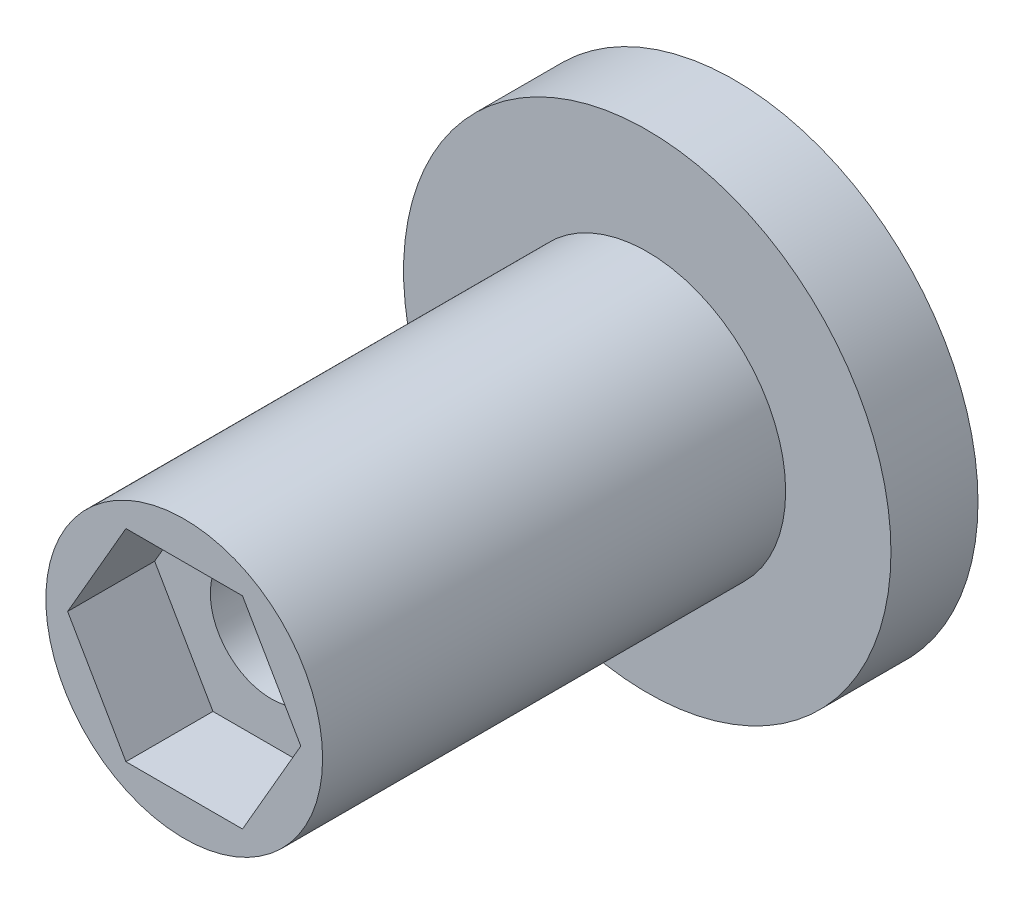
ISO-10303-21;
HEADER;
FILE_DESCRIPTION(('STEP AP214'),'2;1');
FILE_NAME('part.step','',(''),(''),'','','');
FILE_SCHEMA(('AUTOMOTIVE_DESIGN { 1 0 10303 214 1 1 1 1 }'));
ENDSEC;
DATA;
#1=APPLICATION_CONTEXT('core data for automotive mechanical design processes');
#2=APPLICATION_PROTOCOL_DEFINITION('international standard','automotive_design',2000,#1);
#3=PRODUCT_CONTEXT('',#1,'mechanical');
#4=PRODUCT('Part','Part','',(#3));
#5=PRODUCT_RELATED_PRODUCT_CATEGORY('part','',(#4));
#6=PRODUCT_DEFINITION_FORMATION('','',#4);
#7=PRODUCT_DEFINITION_CONTEXT('part definition',#1,'design');
#8=PRODUCT_DEFINITION('design','',#6,#7);
#9=PRODUCT_DEFINITION_SHAPE('','',#8);
#10=(LENGTH_UNIT() NAMED_UNIT(*) SI_UNIT(.MILLI.,.METRE.));
#11=(NAMED_UNIT(*) PLANE_ANGLE_UNIT() SI_UNIT($,.RADIAN.));
#12=(NAMED_UNIT(*) SI_UNIT($,.STERADIAN.) SOLID_ANGLE_UNIT());
#13=UNCERTAINTY_MEASURE_WITH_UNIT(LENGTH_MEASURE(1.E-05),#10,'distance_accuracy_value','');
#14=(GEOMETRIC_REPRESENTATION_CONTEXT(3) GLOBAL_UNCERTAINTY_ASSIGNED_CONTEXT((#13)) GLOBAL_UNIT_ASSIGNED_CONTEXT((#10,
#11,#12)) REPRESENTATION_CONTEXT('',''));
#15=CARTESIAN_POINT('',(0.,0.,0.));
#16=DIRECTION('',(0.,0.,1.));
#17=DIRECTION('',(1.,0.,0.));
#18=AXIS2_PLACEMENT_3D('',#15,#16,#17);
#19=CARTESIAN_POINT('',(3.348729792148,0.,-31.9));
#20=DIRECTION('',(-0.866025403784329,-0.50000000000019,0.));
#21=DIRECTION('',(-0.50000000000019,0.866025403784329,0.));
#22=AXIS2_PLACEMENT_3D('',#19,#20,#21);
#23=PLANE('',#22);
#24=DIRECTION('',(0.,0.,-1.));
#25=VECTOR('',#24,1.);
#26=CARTESIAN_POINT('',(3.348729792148,0.,-30.6));
#27=LINE('',#26,#25);
#28=CARTESIAN_POINT('',(3.348729792148,0.,-30.7));
#29=VERTEX_POINT('',#28);
#30=CARTESIAN_POINT('',(3.348729792148,0.,-33.2));
#31=VERTEX_POINT('',#30);
#32=EDGE_CURVE('E10',#29,#31,#27,.T.);
#33=ORIENTED_EDGE('',*,*,#32,.F.);
#34=DIRECTION('',(0.50000000000019,-0.866025403784329,0.));
#35=VECTOR('',#34,1.);
#36=CARTESIAN_POINT('',(2.930138568129,0.725021267602,-30.7));
#37=LINE('',#36,#35);
#38=CARTESIAN_POINT('',(1.674364896074,2.90008507041,-30.7));
#39=VERTEX_POINT('',#38);
#40=EDGE_CURVE('E113',#39,#29,#37,.T.);
#41=ORIENTED_EDGE('',*,*,#40,.F.);
#42=DIRECTION('',(0.,0.,1.));
#43=VECTOR('',#42,1.);
#44=CARTESIAN_POINT('',(1.674364896074,2.90008507041,-33.2));
#45=LINE('',#44,#43);
#46=CARTESIAN_POINT('',(1.674364896074,2.90008507041,-33.2));
#47=VERTEX_POINT('',#46);
#48=EDGE_CURVE('E164',#47,#39,#45,.T.);
#49=ORIENTED_EDGE('',*,*,#48,.F.);
#50=DIRECTION('',(-0.50000000000019,0.866025403784329,0.));
#51=VECTOR('',#50,1.);
#52=CARTESIAN_POINT('',(3.348729792148,0.,-33.2));
#53=LINE('',#52,#51);
#54=EDGE_CURVE('E116',#31,#47,#53,.T.);
#55=ORIENTED_EDGE('',*,*,#54,.F.);
#56=EDGE_LOOP('',(#33,#41,#49,#55));
#57=FACE_BOUND('',#56,.T.);
#58=ADVANCED_FACE('F16',(#57),#23,.T.);
#59=CARTESIAN_POINT('',(1.674364896074,-2.90008507041,-31.9));
#60=DIRECTION('',(-0.866025403784329,0.50000000000019,0.));
#61=DIRECTION('',(0.,0.,1.));
#62=AXIS2_PLACEMENT_3D('',#59,#60,#61);
#63=PLANE('',#62);
#64=DIRECTION('',(0.,0.,-1.));
#65=VECTOR('',#64,1.);
#66=CARTESIAN_POINT('',(1.674364896074,-2.90008507041,-30.6));
#67=LINE('',#66,#65);
#68=CARTESIAN_POINT('',(1.674364896074,-2.90008507041,-30.7));
#69=VERTEX_POINT('',#68);
#70=CARTESIAN_POINT('',(1.674364896074,-2.90008507041,-33.2));
#71=VERTEX_POINT('',#70);
#72=EDGE_CURVE('E25',#69,#71,#67,.T.);
#73=ORIENTED_EDGE('',*,*,#72,.F.);
#74=DIRECTION('',(-0.50000000000019,-0.866025403784329,0.));
#75=VECTOR('',#74,1.);
#76=CARTESIAN_POINT('',(2.092956120092,-2.175063802807,-30.7));
#77=LINE('',#76,#75);
#78=EDGE_CURVE('E120',#29,#69,#77,.T.);
#79=ORIENTED_EDGE('',*,*,#78,.F.);
#80=ORIENTED_EDGE('',*,*,#32,.T.);
#81=DIRECTION('',(0.50000000000019,0.866025403784329,0.));
#82=VECTOR('',#81,1.);
#83=CARTESIAN_POINT('',(1.674364896074,-2.90008507041,-33.2));
#84=LINE('',#83,#82);
#85=EDGE_CURVE('E161',#71,#31,#84,.T.);
#86=ORIENTED_EDGE('',*,*,#85,.F.);
#87=EDGE_LOOP('',(#73,#79,#80,#86));
#88=FACE_BOUND('',#87,.T.);
#89=ADVANCED_FACE('F121',(#88),#63,.T.);
#90=CARTESIAN_POINT('',(-1.674364896074,-2.90008507041,-31.9));
#91=DIRECTION('',(0.,1.,0.));
#92=DIRECTION('',(1.,0.,0.));
#93=AXIS2_PLACEMENT_3D('',#90,#91,#92);
#94=PLANE('',#93);
#95=DIRECTION('',(0.,0.,-1.));
#96=VECTOR('',#95,1.);
#97=CARTESIAN_POINT('',(-1.674364896074,-2.90008507041,-30.6));
#98=LINE('',#97,#96);
#99=CARTESIAN_POINT('',(-1.674364896074,-2.90008507041,-30.7));
#100=VERTEX_POINT('',#99);
#101=CARTESIAN_POINT('',(-1.674364896074,-2.90008507041,-33.2));
#102=VERTEX_POINT('',#101);
#103=EDGE_CURVE('E46',#100,#102,#98,.T.);
#104=ORIENTED_EDGE('',*,*,#103,.F.);
#105=DIRECTION('',(-1.,0.,0.));
#106=VECTOR('',#105,1.);
#107=CARTESIAN_POINT('',(-0.837182448037,-2.90008507041,-30.7));
#108=LINE('',#107,#106);
#109=EDGE_CURVE('E125',#69,#100,#108,.T.);
#110=ORIENTED_EDGE('',*,*,#109,.F.);
#111=ORIENTED_EDGE('',*,*,#72,.T.);
#112=DIRECTION('',(1.,0.,0.));
#113=VECTOR('',#112,1.);
#114=CARTESIAN_POINT('',(-1.674364896074,-2.90008507041,-33.2));
#115=LINE('',#114,#113);
#116=EDGE_CURVE('E157',#102,#71,#115,.T.);
#117=ORIENTED_EDGE('',*,*,#116,.F.);
#118=EDGE_LOOP('',(#104,#110,#111,#117));
#119=FACE_BOUND('',#118,.T.);
#120=ADVANCED_FACE('F214',(#119),#94,.T.);
#121=CARTESIAN_POINT('',(-3.348729792148,0.,-31.9));
#122=DIRECTION('',(0.866025403784329,0.50000000000019,0.));
#123=DIRECTION('',(0.,0.,-1.));
#124=AXIS2_PLACEMENT_3D('',#121,#122,#123);
#125=PLANE('',#124);
#126=DIRECTION('',(0.,0.,1.));
#127=VECTOR('',#126,1.);
#128=CARTESIAN_POINT('',(-3.348729792148,0.,-33.2));
#129=LINE('',#128,#127);
#130=CARTESIAN_POINT('',(-3.348729792148,0.,-33.2));
#131=VERTEX_POINT('',#130);
#132=CARTESIAN_POINT('',(-3.348729792148,0.,-30.7));
#133=VERTEX_POINT('',#132);
#134=EDGE_CURVE('E170',#131,#133,#129,.T.);
#135=ORIENTED_EDGE('',*,*,#134,.T.);
#136=DIRECTION('',(-0.50000000000019,0.866025403784329,0.));
#137=VECTOR('',#136,1.);
#138=CARTESIAN_POINT('',(-2.930138568129,-0.725021267602,-30.7));
#139=LINE('',#138,#137);
#140=EDGE_CURVE('E145',#100,#133,#139,.T.);
#141=ORIENTED_EDGE('',*,*,#140,.F.);
#142=ORIENTED_EDGE('',*,*,#103,.T.);
#143=DIRECTION('',(0.50000000000019,-0.866025403784329,0.));
#144=VECTOR('',#143,1.);
#145=CARTESIAN_POINT('',(-3.348729792148,0.,-33.2));
#146=LINE('',#145,#144);
#147=EDGE_CURVE('E156',#131,#102,#146,.T.);
#148=ORIENTED_EDGE('',*,*,#147,.F.);
#149=EDGE_LOOP('',(#135,#141,#142,#148));
#150=FACE_BOUND('',#149,.T.);
#151=ADVANCED_FACE('F18',(#150),#125,.T.);
#152=CARTESIAN_POINT('',(-1.674364896074,2.90008507041,-31.9));
#153=DIRECTION('',(0.866025403784329,-0.50000000000019,0.));
#154=DIRECTION('',(0.,0.,-1.));
#155=AXIS2_PLACEMENT_3D('',#152,#153,#154);
#156=PLANE('',#155);
#157=DIRECTION('',(0.,0.,1.));
#158=VECTOR('',#157,1.);
#159=CARTESIAN_POINT('',(-1.674364896074,2.90008507041,-33.2));
#160=LINE('',#159,#158);
#161=CARTESIAN_POINT('',(-1.674364896074,2.90008507041,-33.2));
#162=VERTEX_POINT('',#161);
#163=CARTESIAN_POINT('',(-1.674364896074,2.90008507041,-30.7));
#164=VERTEX_POINT('',#163);
#165=EDGE_CURVE('E167',#162,#164,#160,.T.);
#166=ORIENTED_EDGE('',*,*,#165,.T.);
#167=DIRECTION('',(0.50000000000019,0.866025403784329,0.));
#168=VECTOR('',#167,1.);
#169=CARTESIAN_POINT('',(-2.092956120092,2.175063802807,-30.7));
#170=LINE('',#169,#168);
#171=EDGE_CURVE('E140',#133,#164,#170,.T.);
#172=ORIENTED_EDGE('',*,*,#171,.F.);
#173=ORIENTED_EDGE('',*,*,#134,.F.);
#174=DIRECTION('',(-0.50000000000019,-0.866025403784329,0.));
#175=VECTOR('',#174,1.);
#176=CARTESIAN_POINT('',(-1.674364896074,2.90008507041,-33.2));
#177=LINE('',#176,#175);
#178=EDGE_CURVE('E152',#162,#131,#177,.T.);
#179=ORIENTED_EDGE('',*,*,#178,.F.);
#180=EDGE_LOOP('',(#166,#172,#173,#179));
#181=FACE_BOUND('',#180,.T.);
#182=ADVANCED_FACE('F263',(#181),#156,.T.);
#183=CARTESIAN_POINT('',(1.674364896074,2.90008507041,-31.9));
#184=DIRECTION('',(0.,-1.,0.));
#185=DIRECTION('',(-1.,0.,0.));
#186=AXIS2_PLACEMENT_3D('',#183,#184,#185);
#187=PLANE('',#186);
#188=ORIENTED_EDGE('',*,*,#48,.T.);
#189=DIRECTION('',(1.,0.,0.));
#190=VECTOR('',#189,1.);
#191=CARTESIAN_POINT('',(0.837182448037,2.90008507041,-30.7));
#192=LINE('',#191,#190);
#193=EDGE_CURVE('E131',#164,#39,#192,.T.);
#194=ORIENTED_EDGE('',*,*,#193,.F.);
#195=ORIENTED_EDGE('',*,*,#165,.F.);
#196=DIRECTION('',(-1.,0.,0.));
#197=VECTOR('',#196,1.);
#198=CARTESIAN_POINT('',(1.674364896074,2.90008507041,-33.2));
#199=LINE('',#198,#197);
#200=EDGE_CURVE('E144',#47,#162,#199,.T.);
#201=ORIENTED_EDGE('',*,*,#200,.F.);
#202=EDGE_LOOP('',(#188,#194,#195,#201));
#203=FACE_BOUND('',#202,.T.);
#204=ADVANCED_FACE('F254',(#203),#187,.T.);
#205=CARTESIAN_POINT('',(0.,0.,-33.2));
#206=DIRECTION('',(0.,0.,1.));
#207=DIRECTION('',(1.,0.,0.));
#208=AXIS2_PLACEMENT_3D('',#205,#206,#207);
#209=PLANE('',#208);
#210=CARTESIAN_POINT('',(0.,0.,-33.2));
#211=DIRECTION('',(0.,0.,1.));
#212=DIRECTION('',(1.,0.,0.));
#213=AXIS2_PLACEMENT_3D('',#210,#211,#212);
#214=CIRCLE('',#213,1.75);
#215=CARTESIAN_POINT('',(1.75,0.,-33.2));
#216=VERTEX_POINT('',#215);
#217=EDGE_CURVE('E137',#216,#216,#214,.T.);
#218=ORIENTED_EDGE('',*,*,#217,.F.);
#219=EDGE_LOOP('',(#218));
#220=FACE_BOUND('',#219,.T.);
#221=ORIENTED_EDGE('',*,*,#54,.T.);
#222=ORIENTED_EDGE('',*,*,#200,.T.);
#223=ORIENTED_EDGE('',*,*,#178,.T.);
#224=ORIENTED_EDGE('',*,*,#147,.T.);
#225=ORIENTED_EDGE('',*,*,#116,.T.);
#226=ORIENTED_EDGE('',*,*,#85,.T.);
#227=EDGE_LOOP('',(#221,#222,#223,#224,#225,#226));
#228=FACE_BOUND('',#227,.T.);
#229=ADVANCED_FACE('F246',(#220,#228),#209,.T.);
#230=CARTESIAN_POINT('',(0.,0.,-30.7));
#231=DIRECTION('',(0.,0.,1.));
#232=DIRECTION('',(1.,0.,0.));
#233=AXIS2_PLACEMENT_3D('',#230,#231,#232);
#234=PLANE('',#233);
#235=ORIENTED_EDGE('',*,*,#193,.T.);
#236=ORIENTED_EDGE('',*,*,#40,.T.);
#237=ORIENTED_EDGE('',*,*,#78,.T.);
#238=ORIENTED_EDGE('',*,*,#109,.T.);
#239=ORIENTED_EDGE('',*,*,#140,.T.);
#240=ORIENTED_EDGE('',*,*,#171,.T.);
#241=EDGE_LOOP('',(#235,#236,#237,#238,#239,#240));
#242=FACE_BOUND('',#241,.T.);
#243=CARTESIAN_POINT('',(0.,0.,-30.7));
#244=DIRECTION('',(0.,0.,1.));
#245=DIRECTION('',(1.,0.,0.));
#246=AXIS2_PLACEMENT_3D('',#243,#244,#245);
#247=CIRCLE('',#246,3.975);
#248=CARTESIAN_POINT('',(3.975,0.,-30.7));
#249=VERTEX_POINT('',#248);
#250=EDGE_CURVE('E348',#249,#249,#247,.T.);
#251=ORIENTED_EDGE('',*,*,#250,.T.);
#252=EDGE_LOOP('',(#251));
#253=FACE_BOUND('',#252,.T.);
#254=ADVANCED_FACE('F127',(#242,#253),#234,.T.);
#255=CARTESIAN_POINT('',(0.,0.,-47.));
#256=DIRECTION('',(0.,0.,1.));
#257=DIRECTION('',(1.,0.,0.));
#258=AXIS2_PLACEMENT_3D('',#255,#256,#257);
#259=CYLINDRICAL_SURFACE('',#258,1.75);
#260=DIRECTION('',(0.,0.,1.));
#261=VECTOR('',#260,1.);
#262=CARTESIAN_POINT('',(1.75,0.,-47.));
#263=LINE('',#262,#261);
#264=CARTESIAN_POINT('',(1.75,0.,-46.5));
#265=VERTEX_POINT('',#264);
#266=EDGE_CURVE('E355',#265,#216,#263,.T.);
#267=ORIENTED_EDGE('',*,*,#266,.F.);
#268=CARTESIAN_POINT('',(0.,0.,-46.5));
#269=DIRECTION('',(0.,0.,1.));
#270=DIRECTION('',(1.,0.,0.));
#271=AXIS2_PLACEMENT_3D('',#268,#269,#270);
#272=CIRCLE('',#271,1.75);
#273=EDGE_CURVE('E345',#265,#265,#272,.T.);
#274=ORIENTED_EDGE('',*,*,#273,.F.);
#275=ORIENTED_EDGE('',*,*,#266,.T.);
#276=ORIENTED_EDGE('',*,*,#217,.T.);
#277=EDGE_LOOP('',(#267,#274,#275,#276));
#278=FACE_BOUND('',#277,.T.);
#279=ADVANCED_FACE('F222',(#278),#259,.F.);
#280=CARTESIAN_POINT('',(0.,0.,-44.));
#281=DIRECTION('',(0.,0.,1.));
#282=DIRECTION('',(1.,0.,0.));
#283=AXIS2_PLACEMENT_3D('',#280,#281,#282);
#284=CYLINDRICAL_SURFACE('',#283,3.975);
#285=ORIENTED_EDGE('',*,*,#250,.F.);
#286=DIRECTION('',(0.,0.,1.));
#287=VECTOR('',#286,1.);
#288=CARTESIAN_POINT('',(3.975,0.,-44.));
#289=LINE('',#288,#287);
#290=CARTESIAN_POINT('',(3.975,0.,-44.));
#291=VERTEX_POINT('',#290);
#292=EDGE_CURVE('E352',#291,#249,#289,.T.);
#293=ORIENTED_EDGE('',*,*,#292,.F.);
#294=CARTESIAN_POINT('',(0.,0.,-44.));
#295=DIRECTION('',(0.,0.,1.));
#296=DIRECTION('',(1.,0.,0.));
#297=AXIS2_PLACEMENT_3D('',#294,#295,#296);
#298=CIRCLE('',#297,3.975);
#299=EDGE_CURVE('E343',#291,#291,#298,.T.);
#300=ORIENTED_EDGE('',*,*,#299,.T.);
#301=ORIENTED_EDGE('',*,*,#292,.T.);
#302=EDGE_LOOP('',(#285,#293,#300,#301));
#303=FACE_BOUND('',#302,.T.);
#304=ADVANCED_FACE('F187',(#303),#284,.T.);
#305=CARTESIAN_POINT('',(0.,0.,-46.5));
#306=DIRECTION('',(0.,0.,1.));
#307=DIRECTION('',(1.,0.,0.));
#308=AXIS2_PLACEMENT_3D('',#305,#306,#307);
#309=PLANE('',#308);
#310=ORIENTED_EDGE('',*,*,#273,.T.);
#311=EDGE_LOOP('',(#310));
#312=FACE_BOUND('',#311,.T.);
#313=CARTESIAN_POINT('',(0.,0.,-46.5));
#314=DIRECTION('',(0.,0.,1.));
#315=DIRECTION('',(1.,0.,0.));
#316=AXIS2_PLACEMENT_3D('',#313,#314,#315);
#317=CIRCLE('',#316,7.);
#318=CARTESIAN_POINT('',(7.,0.,-46.5));
#319=VERTEX_POINT('',#318);
#320=EDGE_CURVE('E367',#319,#319,#317,.T.);
#321=ORIENTED_EDGE('',*,*,#320,.F.);
#322=EDGE_LOOP('',(#321));
#323=FACE_BOUND('',#322,.T.);
#324=ADVANCED_FACE('F181',(#312,#323),#309,.F.);
#325=CARTESIAN_POINT('',(0.,0.,-44.));
#326=DIRECTION('',(0.,0.,1.));
#327=DIRECTION('',(1.,0.,0.));
#328=AXIS2_PLACEMENT_3D('',#325,#326,#327);
#329=PLANE('',#328);
#330=ORIENTED_EDGE('',*,*,#299,.F.);
#331=EDGE_LOOP('',(#330));
#332=FACE_BOUND('',#331,.T.);
#333=CARTESIAN_POINT('',(0.,0.,-44.));
#334=DIRECTION('',(0.,0.,1.));
#335=DIRECTION('',(1.,0.,0.));
#336=AXIS2_PLACEMENT_3D('',#333,#334,#335);
#337=CIRCLE('',#336,7.);
#338=CARTESIAN_POINT('',(7.,0.,-44.));
#339=VERTEX_POINT('',#338);
#340=EDGE_CURVE('E373',#339,#339,#337,.T.);
#341=ORIENTED_EDGE('',*,*,#340,.T.);
#342=EDGE_LOOP('',(#341));
#343=FACE_BOUND('',#342,.T.);
#344=ADVANCED_FACE('F186',(#332,#343),#329,.T.);
#345=CARTESIAN_POINT('',(0.,0.,-46.5));
#346=DIRECTION('',(0.,0.,1.));
#347=DIRECTION('',(1.,0.,0.));
#348=AXIS2_PLACEMENT_3D('',#345,#346,#347);
#349=CYLINDRICAL_SURFACE('',#348,7.);
#350=ORIENTED_EDGE('',*,*,#340,.F.);
#351=DIRECTION('',(0.,0.,1.));
#352=VECTOR('',#351,1.);
#353=CARTESIAN_POINT('',(7.,0.,-46.5));
#354=LINE('',#353,#352);
#355=EDGE_CURVE('E370',#319,#339,#354,.T.);
#356=ORIENTED_EDGE('',*,*,#355,.F.);
#357=ORIENTED_EDGE('',*,*,#320,.T.);
#358=ORIENTED_EDGE('',*,*,#355,.T.);
#359=EDGE_LOOP('',(#350,#356,#357,#358));
#360=FACE_BOUND('',#359,.T.);
#361=ADVANCED_FACE('F194',(#360),#349,.T.);
#362=CLOSED_SHELL('',(#58,#89,#120,#151,#182,#204,#229,#254,#279,#304,#324,#344,#361));
#363=MANIFOLD_SOLID_BREP('B1',#362);
#364=ADVANCED_BREP_SHAPE_REPRESENTATION('',(#18,#363),#14);
#365=SHAPE_DEFINITION_REPRESENTATION(#9,#364);
ENDSEC;
END-ISO-10303-21;
